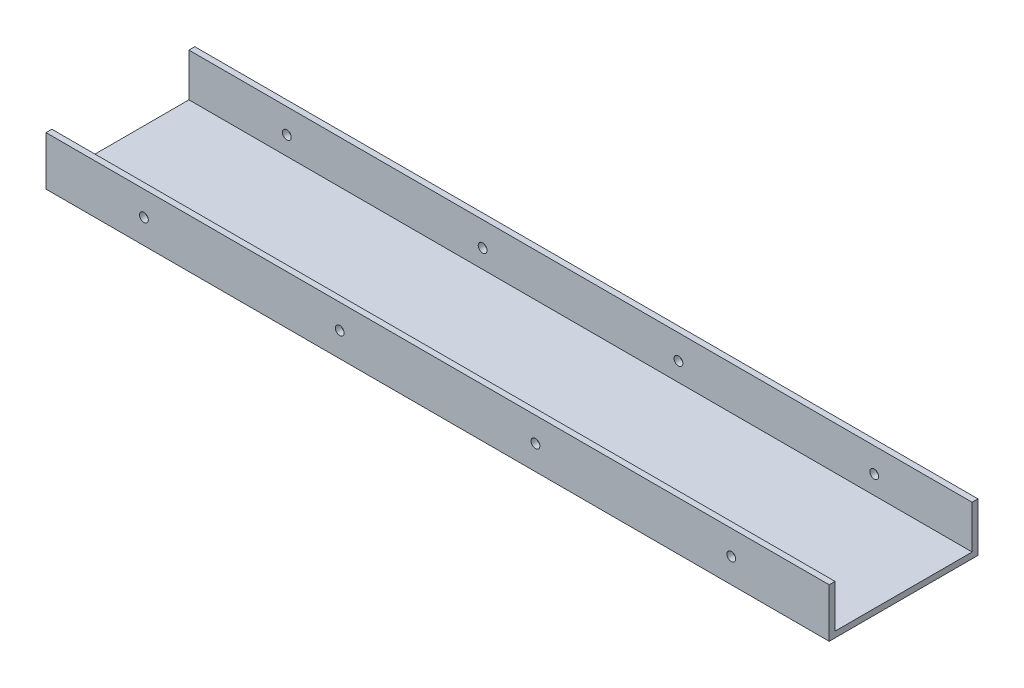
ISO-10303-21;
HEADER;
FILE_DESCRIPTION(('STEP AP214'),'2;1');
FILE_NAME('part.step','',(''),(''),'','','');
FILE_SCHEMA(('AUTOMOTIVE_DESIGN { 1 0 10303 214 1 1 1 1 }'));
ENDSEC;
DATA;
#1=APPLICATION_CONTEXT('core data for automotive mechanical design processes');
#2=APPLICATION_PROTOCOL_DEFINITION('international standard','automotive_design',2000,#1);
#3=PRODUCT_CONTEXT('',#1,'mechanical');
#4=PRODUCT('Part','Part','',(#3));
#5=PRODUCT_RELATED_PRODUCT_CATEGORY('part','',(#4));
#6=PRODUCT_DEFINITION_FORMATION('','',#4);
#7=PRODUCT_DEFINITION_CONTEXT('part definition',#1,'design');
#8=PRODUCT_DEFINITION('design','',#6,#7);
#9=PRODUCT_DEFINITION_SHAPE('','',#8);
#10=(LENGTH_UNIT() NAMED_UNIT(*) SI_UNIT(.MILLI.,.METRE.));
#11=(NAMED_UNIT(*) PLANE_ANGLE_UNIT() SI_UNIT($,.RADIAN.));
#12=(NAMED_UNIT(*) SI_UNIT($,.STERADIAN.) SOLID_ANGLE_UNIT());
#13=UNCERTAINTY_MEASURE_WITH_UNIT(LENGTH_MEASURE(1.E-05),#10,'distance_accuracy_value','');
#14=(GEOMETRIC_REPRESENTATION_CONTEXT(3) GLOBAL_UNCERTAINTY_ASSIGNED_CONTEXT((#13)) GLOBAL_UNIT_ASSIGNED_CONTEXT((#10,
#11,#12)) REPRESENTATION_CONTEXT('',''));
#15=CARTESIAN_POINT('',(0.,0.,0.));
#16=DIRECTION('',(0.,0.,1.));
#17=DIRECTION('',(1.,0.,0.));
#18=AXIS2_PLACEMENT_3D('',#15,#16,#17);
#19=CARTESIAN_POINT('',(0.,3.,0.));
#20=DIRECTION('',(0.,1.,0.));
#21=DIRECTION('',(0.,0.,1.));
#22=AXIS2_PLACEMENT_3D('',#19,#20,#21);
#23=PLANE('',#22);
#24=DIRECTION('',(0.,0.,-1.));
#25=VECTOR('',#24,1.);
#26=CARTESIAN_POINT('',(200.,3.,-38.));
#27=LINE('',#26,#25);
#28=CARTESIAN_POINT('',(200.,3.,35.));
#29=VERTEX_POINT('',#28);
#30=CARTESIAN_POINT('',(200.,3.,-35.));
#31=VERTEX_POINT('',#30);
#32=EDGE_CURVE('E63',#29,#31,#27,.T.);
#33=ORIENTED_EDGE('',*,*,#32,.T.);
#34=DIRECTION('',(1.,0.,0.));
#35=VECTOR('',#34,1.);
#36=CARTESIAN_POINT('',(-200.,3.,-35.));
#37=LINE('',#36,#35);
#38=CARTESIAN_POINT('',(-200.,3.,-35.));
#39=VERTEX_POINT('',#38);
#40=EDGE_CURVE('E58',#39,#31,#37,.T.);
#41=ORIENTED_EDGE('',*,*,#40,.F.);
#42=DIRECTION('',(0.,0.,1.));
#43=VECTOR('',#42,1.);
#44=CARTESIAN_POINT('',(-200.,3.,-38.));
#45=LINE('',#44,#43);
#46=CARTESIAN_POINT('',(-200.,3.,35.));
#47=VERTEX_POINT('',#46);
#48=EDGE_CURVE('E170',#39,#47,#45,.T.);
#49=ORIENTED_EDGE('',*,*,#48,.T.);
#50=DIRECTION('',(-1.,0.,0.));
#51=VECTOR('',#50,1.);
#52=CARTESIAN_POINT('',(-200.,3.,35.));
#53=LINE('',#52,#51);
#54=EDGE_CURVE('E139',#29,#47,#53,.T.);
#55=ORIENTED_EDGE('',*,*,#54,.F.);
#56=EDGE_LOOP('',(#33,#41,#49,#55));
#57=FACE_BOUND('',#56,.T.);
#58=ADVANCED_FACE('F40',(#57),#23,.T.);
#59=CARTESIAN_POINT('',(-200.,3.,-38.));
#60=DIRECTION('',(1.,0.,0.));
#61=DIRECTION('',(0.,0.,-1.));
#62=AXIS2_PLACEMENT_3D('',#59,#60,#61);
#63=PLANE('',#62);
#64=DIRECTION('',(0.,0.,1.));
#65=VECTOR('',#64,1.);
#66=CARTESIAN_POINT('',(-200.,0.,-38.));
#67=LINE('',#66,#65);
#68=CARTESIAN_POINT('',(-200.,0.,-38.));
#69=VERTEX_POINT('',#68);
#70=CARTESIAN_POINT('',(-200.,0.,38.));
#71=VERTEX_POINT('',#70);
#72=EDGE_CURVE('E169',#69,#71,#67,.T.);
#73=ORIENTED_EDGE('',*,*,#72,.T.);
#74=DIRECTION('',(0.,-1.,0.));
#75=VECTOR('',#74,1.);
#76=CARTESIAN_POINT('',(-200.,3.,38.));
#77=LINE('',#76,#75);
#78=CARTESIAN_POINT('',(-200.,25.,38.));
#79=VERTEX_POINT('',#78);
#80=EDGE_CURVE('E11',#79,#71,#77,.T.);
#81=ORIENTED_EDGE('',*,*,#80,.F.);
#82=DIRECTION('',(0.,0.,1.));
#83=VECTOR('',#82,1.);
#84=CARTESIAN_POINT('',(-200.,25.,38.));
#85=LINE('',#84,#83);
#86=CARTESIAN_POINT('',(-200.,25.,35.));
#87=VERTEX_POINT('',#86);
#88=EDGE_CURVE('E144',#87,#79,#85,.T.);
#89=ORIENTED_EDGE('',*,*,#88,.F.);
#90=DIRECTION('',(0.,-1.,0.));
#91=VECTOR('',#90,1.);
#92=CARTESIAN_POINT('',(-200.,25.,35.));
#93=LINE('',#92,#91);
#94=EDGE_CURVE('E158',#87,#47,#93,.T.);
#95=ORIENTED_EDGE('',*,*,#94,.T.);
#96=ORIENTED_EDGE('',*,*,#48,.F.);
#97=DIRECTION('',(0.,-1.,0.));
#98=VECTOR('',#97,1.);
#99=CARTESIAN_POINT('',(-200.,25.,-35.));
#100=LINE('',#99,#98);
#101=CARTESIAN_POINT('',(-200.,25.,-35.));
#102=VERTEX_POINT('',#101);
#103=EDGE_CURVE('E132',#102,#39,#100,.T.);
#104=ORIENTED_EDGE('',*,*,#103,.F.);
#105=DIRECTION('',(0.,0.,1.));
#106=VECTOR('',#105,1.);
#107=CARTESIAN_POINT('',(-200.,25.,-38.));
#108=LINE('',#107,#106);
#109=CARTESIAN_POINT('',(-200.,25.,-38.));
#110=VERTEX_POINT('',#109);
#111=EDGE_CURVE('E124',#110,#102,#108,.T.);
#112=ORIENTED_EDGE('',*,*,#111,.F.);
#113=DIRECTION('',(0.,-1.,0.));
#114=VECTOR('',#113,1.);
#115=CARTESIAN_POINT('',(-200.,3.,-38.));
#116=LINE('',#115,#114);
#117=EDGE_CURVE('E106',#110,#69,#116,.T.);
#118=ORIENTED_EDGE('',*,*,#117,.T.);
#119=EDGE_LOOP('',(#73,#81,#89,#95,#96,#104,#112,#118));
#120=FACE_BOUND('',#119,.T.);
#121=ADVANCED_FACE('F42',(#120),#63,.F.);
#122=CARTESIAN_POINT('',(-200.,3.,38.));
#123=DIRECTION('',(0.,0.,-1.));
#124=DIRECTION('',(-1.,0.,0.));
#125=AXIS2_PLACEMENT_3D('',#122,#123,#124);
#126=PLANE('',#125);
#127=CARTESIAN_POINT('',(-150.,12.5,38.));
#128=DIRECTION('',(0.,0.,1.));
#129=DIRECTION('',(1.,0.,0.));
#130=AXIS2_PLACEMENT_3D('',#127,#128,#129);
#131=CIRCLE('',#130,2.24999999999997);
#132=CARTESIAN_POINT('',(-147.75,12.5,38.));
#133=VERTEX_POINT('',#132);
#134=EDGE_CURVE('E309',#133,#133,#131,.T.);
#135=ORIENTED_EDGE('',*,*,#134,.F.);
#136=EDGE_LOOP('',(#135));
#137=FACE_BOUND('',#136,.T.);
#138=CARTESIAN_POINT('',(150.,12.5,38.));
#139=DIRECTION('',(0.,0.,1.));
#140=DIRECTION('',(1.,0.,0.));
#141=AXIS2_PLACEMENT_3D('',#138,#139,#140);
#142=CIRCLE('',#141,2.24999999999997);
#143=CARTESIAN_POINT('',(152.25,12.5,38.));
#144=VERTEX_POINT('',#143);
#145=EDGE_CURVE('E209',#144,#144,#142,.T.);
#146=ORIENTED_EDGE('',*,*,#145,.F.);
#147=EDGE_LOOP('',(#146));
#148=FACE_BOUND('',#147,.T.);
#149=CARTESIAN_POINT('',(-50.,12.5,38.));
#150=DIRECTION('',(0.,0.,1.));
#151=DIRECTION('',(1.,0.,0.));
#152=AXIS2_PLACEMENT_3D('',#149,#150,#151);
#153=CIRCLE('',#152,2.24999999999999);
#154=CARTESIAN_POINT('',(-47.75,12.5,38.));
#155=VERTEX_POINT('',#154);
#156=EDGE_CURVE('E206',#155,#155,#153,.T.);
#157=ORIENTED_EDGE('',*,*,#156,.F.);
#158=EDGE_LOOP('',(#157));
#159=FACE_BOUND('',#158,.T.);
#160=CARTESIAN_POINT('',(50.,12.5,38.));
#161=DIRECTION('',(0.,0.,1.));
#162=DIRECTION('',(1.,0.,0.));
#163=AXIS2_PLACEMENT_3D('',#160,#161,#162);
#164=CIRCLE('',#163,2.24999999999999);
#165=CARTESIAN_POINT('',(52.25,12.5,38.));
#166=VERTEX_POINT('',#165);
#167=EDGE_CURVE('E235',#166,#166,#164,.T.);
#168=ORIENTED_EDGE('',*,*,#167,.F.);
#169=EDGE_LOOP('',(#168));
#170=FACE_BOUND('',#169,.T.);
#171=DIRECTION('',(1.,0.,0.));
#172=VECTOR('',#171,1.);
#173=CARTESIAN_POINT('',(-200.,0.,38.));
#174=LINE('',#173,#172);
#175=CARTESIAN_POINT('',(200.,0.,38.));
#176=VERTEX_POINT('',#175);
#177=EDGE_CURVE('E177',#71,#176,#174,.T.);
#178=ORIENTED_EDGE('',*,*,#177,.T.);
#179=DIRECTION('',(0.,-1.,0.));
#180=VECTOR('',#179,1.);
#181=CARTESIAN_POINT('',(200.,3.,38.));
#182=LINE('',#181,#180);
#183=CARTESIAN_POINT('',(200.,25.,38.));
#184=VERTEX_POINT('',#183);
#185=EDGE_CURVE('E50',#184,#176,#182,.T.);
#186=ORIENTED_EDGE('',*,*,#185,.F.);
#187=DIRECTION('',(1.,0.,0.));
#188=VECTOR('',#187,1.);
#189=CARTESIAN_POINT('',(-200.,25.,38.));
#190=LINE('',#189,#188);
#191=EDGE_CURVE('E148',#79,#184,#190,.T.);
#192=ORIENTED_EDGE('',*,*,#191,.F.);
#193=ORIENTED_EDGE('',*,*,#80,.T.);
#194=EDGE_LOOP('',(#178,#186,#192,#193));
#195=FACE_BOUND('',#194,.T.);
#196=ADVANCED_FACE('F291',(#137,#148,#159,#170,#195),#126,.F.);
#197=CARTESIAN_POINT('',(200.,3.,-38.));
#198=DIRECTION('',(-1.,0.,0.));
#199=DIRECTION('',(0.,0.,1.));
#200=AXIS2_PLACEMENT_3D('',#197,#198,#199);
#201=PLANE('',#200);
#202=DIRECTION('',(0.,0.,-1.));
#203=VECTOR('',#202,1.);
#204=CARTESIAN_POINT('',(200.,0.,-38.));
#205=LINE('',#204,#203);
#206=CARTESIAN_POINT('',(200.,0.,-38.));
#207=VERTEX_POINT('',#206);
#208=EDGE_CURVE('E180',#176,#207,#205,.T.);
#209=ORIENTED_EDGE('',*,*,#208,.T.);
#210=DIRECTION('',(0.,-1.,0.));
#211=VECTOR('',#210,1.);
#212=CARTESIAN_POINT('',(200.,3.,-38.));
#213=LINE('',#212,#211);
#214=CARTESIAN_POINT('',(200.,25.,-38.));
#215=VERTEX_POINT('',#214);
#216=EDGE_CURVE('E118',#215,#207,#213,.T.);
#217=ORIENTED_EDGE('',*,*,#216,.F.);
#218=DIRECTION('',(0.,0.,-1.));
#219=VECTOR('',#218,1.);
#220=CARTESIAN_POINT('',(200.,25.,-38.));
#221=LINE('',#220,#219);
#222=CARTESIAN_POINT('',(200.,25.,-35.));
#223=VERTEX_POINT('',#222);
#224=EDGE_CURVE('E127',#223,#215,#221,.T.);
#225=ORIENTED_EDGE('',*,*,#224,.F.);
#226=DIRECTION('',(0.,-1.,0.));
#227=VECTOR('',#226,1.);
#228=CARTESIAN_POINT('',(200.,25.,-35.));
#229=LINE('',#228,#227);
#230=EDGE_CURVE('E129',#223,#31,#229,.T.);
#231=ORIENTED_EDGE('',*,*,#230,.T.);
#232=ORIENTED_EDGE('',*,*,#32,.F.);
#233=DIRECTION('',(0.,-1.,0.));
#234=VECTOR('',#233,1.);
#235=CARTESIAN_POINT('',(200.,25.,35.));
#236=LINE('',#235,#234);
#237=CARTESIAN_POINT('',(200.,25.,35.));
#238=VERTEX_POINT('',#237);
#239=EDGE_CURVE('E165',#238,#29,#236,.T.);
#240=ORIENTED_EDGE('',*,*,#239,.F.);
#241=DIRECTION('',(0.,0.,-1.));
#242=VECTOR('',#241,1.);
#243=CARTESIAN_POINT('',(200.,25.,38.));
#244=LINE('',#243,#242);
#245=EDGE_CURVE('E152',#184,#238,#244,.T.);
#246=ORIENTED_EDGE('',*,*,#245,.F.);
#247=ORIENTED_EDGE('',*,*,#185,.T.);
#248=EDGE_LOOP('',(#209,#217,#225,#231,#232,#240,#246,#247));
#249=FACE_BOUND('',#248,.T.);
#250=ADVANCED_FACE('F266',(#249),#201,.F.);
#251=CARTESIAN_POINT('',(-200.,3.,-38.));
#252=DIRECTION('',(0.,0.,1.));
#253=DIRECTION('',(1.,0.,0.));
#254=AXIS2_PLACEMENT_3D('',#251,#252,#253);
#255=PLANE('',#254);
#256=CARTESIAN_POINT('',(-150.,12.5,-38.));
#257=DIRECTION('',(0.,0.,1.));
#258=DIRECTION('',(1.,0.,0.));
#259=AXIS2_PLACEMENT_3D('',#256,#257,#258);
#260=CIRCLE('',#259,2.25);
#261=CARTESIAN_POINT('',(-147.75,12.5,-38.));
#262=VERTEX_POINT('',#261);
#263=EDGE_CURVE('E364',#262,#262,#260,.T.);
#264=ORIENTED_EDGE('',*,*,#263,.T.);
#265=EDGE_LOOP('',(#264));
#266=FACE_BOUND('',#265,.T.);
#267=CARTESIAN_POINT('',(150.,12.5,-38.));
#268=DIRECTION('',(0.,0.,1.));
#269=DIRECTION('',(1.,0.,0.));
#270=AXIS2_PLACEMENT_3D('',#267,#268,#269);
#271=CIRCLE('',#270,2.25);
#272=CARTESIAN_POINT('',(152.25,12.5,-38.));
#273=VERTEX_POINT('',#272);
#274=EDGE_CURVE('E199',#273,#273,#271,.T.);
#275=ORIENTED_EDGE('',*,*,#274,.T.);
#276=EDGE_LOOP('',(#275));
#277=FACE_BOUND('',#276,.T.);
#278=CARTESIAN_POINT('',(-50.,12.5,-38.));
#279=DIRECTION('',(0.,0.,1.));
#280=DIRECTION('',(1.,0.,0.));
#281=AXIS2_PLACEMENT_3D('',#278,#279,#280);
#282=CIRCLE('',#281,2.24999999999999);
#283=CARTESIAN_POINT('',(-47.75,12.5,-38.));
#284=VERTEX_POINT('',#283);
#285=EDGE_CURVE('E223',#284,#284,#282,.T.);
#286=ORIENTED_EDGE('',*,*,#285,.T.);
#287=EDGE_LOOP('',(#286));
#288=FACE_BOUND('',#287,.T.);
#289=CARTESIAN_POINT('',(50.,12.5,-38.));
#290=DIRECTION('',(0.,0.,1.));
#291=DIRECTION('',(1.,0.,0.));
#292=AXIS2_PLACEMENT_3D('',#289,#290,#291);
#293=CIRCLE('',#292,2.24999999999999);
#294=CARTESIAN_POINT('',(52.25,12.5,-38.));
#295=VERTEX_POINT('',#294);
#296=EDGE_CURVE('E194',#295,#295,#293,.T.);
#297=ORIENTED_EDGE('',*,*,#296,.T.);
#298=EDGE_LOOP('',(#297));
#299=FACE_BOUND('',#298,.T.);
#300=DIRECTION('',(-1.,0.,0.));
#301=VECTOR('',#300,1.);
#302=CARTESIAN_POINT('',(-200.,0.,-38.));
#303=LINE('',#302,#301);
#304=EDGE_CURVE('E112',#207,#69,#303,.T.);
#305=ORIENTED_EDGE('',*,*,#304,.T.);
#306=ORIENTED_EDGE('',*,*,#117,.F.);
#307=DIRECTION('',(-1.,0.,0.));
#308=VECTOR('',#307,1.);
#309=CARTESIAN_POINT('',(-200.,25.,-38.));
#310=LINE('',#309,#308);
#311=EDGE_CURVE('E110',#215,#110,#310,.T.);
#312=ORIENTED_EDGE('',*,*,#311,.F.);
#313=ORIENTED_EDGE('',*,*,#216,.T.);
#314=EDGE_LOOP('',(#305,#306,#312,#313));
#315=FACE_BOUND('',#314,.T.);
#316=ADVANCED_FACE('F108',(#266,#277,#288,#299,#315),#255,.F.);
#317=CARTESIAN_POINT('',(0.,0.,0.));
#318=DIRECTION('',(0.,1.,0.));
#319=DIRECTION('',(0.,0.,1.));
#320=AXIS2_PLACEMENT_3D('',#317,#318,#319);
#321=PLANE('',#320);
#322=ORIENTED_EDGE('',*,*,#72,.F.);
#323=ORIENTED_EDGE('',*,*,#304,.F.);
#324=ORIENTED_EDGE('',*,*,#208,.F.);
#325=ORIENTED_EDGE('',*,*,#177,.F.);
#326=EDGE_LOOP('',(#322,#323,#324,#325));
#327=FACE_BOUND('',#326,.T.);
#328=ADVANCED_FACE('F294',(#327),#321,.F.);
#329=CARTESIAN_POINT('',(-200.,25.,35.));
#330=DIRECTION('',(0.,0.,1.));
#331=DIRECTION('',(1.,0.,0.));
#332=AXIS2_PLACEMENT_3D('',#329,#330,#331);
#333=PLANE('',#332);
#334=CARTESIAN_POINT('',(-150.,12.5,35.));
#335=DIRECTION('',(0.,0.,1.));
#336=DIRECTION('',(1.,0.,0.));
#337=AXIS2_PLACEMENT_3D('',#334,#335,#336);
#338=CIRCLE('',#337,2.24999999999999);
#339=CARTESIAN_POINT('',(-147.75,12.5,35.));
#340=VERTEX_POINT('',#339);
#341=EDGE_CURVE('E216',#340,#340,#338,.T.);
#342=ORIENTED_EDGE('',*,*,#341,.T.);
#343=EDGE_LOOP('',(#342));
#344=FACE_BOUND('',#343,.T.);
#345=CARTESIAN_POINT('',(150.,12.5,35.));
#346=DIRECTION('',(0.,0.,1.));
#347=DIRECTION('',(1.,0.,0.));
#348=AXIS2_PLACEMENT_3D('',#345,#346,#347);
#349=CIRCLE('',#348,2.24999999999999);
#350=CARTESIAN_POINT('',(152.25,12.5,35.));
#351=VERTEX_POINT('',#350);
#352=EDGE_CURVE('E195',#351,#351,#349,.T.);
#353=ORIENTED_EDGE('',*,*,#352,.T.);
#354=EDGE_LOOP('',(#353));
#355=FACE_BOUND('',#354,.T.);
#356=CARTESIAN_POINT('',(-50.,12.5,35.));
#357=DIRECTION('',(0.,0.,1.));
#358=DIRECTION('',(1.,0.,0.));
#359=AXIS2_PLACEMENT_3D('',#356,#357,#358);
#360=CIRCLE('',#359,2.24999999999999);
#361=CARTESIAN_POINT('',(-47.75,12.5,35.));
#362=VERTEX_POINT('',#361);
#363=EDGE_CURVE('E227',#362,#362,#360,.T.);
#364=ORIENTED_EDGE('',*,*,#363,.T.);
#365=EDGE_LOOP('',(#364));
#366=FACE_BOUND('',#365,.T.);
#367=CARTESIAN_POINT('',(50.,12.5,35.));
#368=DIRECTION('',(0.,0.,1.));
#369=DIRECTION('',(1.,0.,0.));
#370=AXIS2_PLACEMENT_3D('',#367,#368,#369);
#371=CIRCLE('',#370,2.24999999999999);
#372=CARTESIAN_POINT('',(52.25,12.5,35.));
#373=VERTEX_POINT('',#372);
#374=EDGE_CURVE('E190',#373,#373,#371,.T.);
#375=ORIENTED_EDGE('',*,*,#374,.T.);
#376=EDGE_LOOP('',(#375));
#377=FACE_BOUND('',#376,.T.);
#378=ORIENTED_EDGE('',*,*,#54,.T.);
#379=ORIENTED_EDGE('',*,*,#94,.F.);
#380=DIRECTION('',(-1.,0.,0.));
#381=VECTOR('',#380,1.);
#382=CARTESIAN_POINT('',(-200.,25.,35.));
#383=LINE('',#382,#381);
#384=EDGE_CURVE('E155',#238,#87,#383,.T.);
#385=ORIENTED_EDGE('',*,*,#384,.F.);
#386=ORIENTED_EDGE('',*,*,#239,.T.);
#387=EDGE_LOOP('',(#378,#379,#385,#386));
#388=FACE_BOUND('',#387,.T.);
#389=ADVANCED_FACE('F280',(#344,#355,#366,#377,#388),#333,.F.);
#390=CARTESIAN_POINT('',(0.,25.,0.));
#391=DIRECTION('',(0.,-1.,0.));
#392=DIRECTION('',(0.,0.,-1.));
#393=AXIS2_PLACEMENT_3D('',#390,#391,#392);
#394=PLANE('',#393);
#395=ORIENTED_EDGE('',*,*,#88,.T.);
#396=ORIENTED_EDGE('',*,*,#191,.T.);
#397=ORIENTED_EDGE('',*,*,#245,.T.);
#398=ORIENTED_EDGE('',*,*,#384,.T.);
#399=EDGE_LOOP('',(#395,#396,#397,#398));
#400=FACE_BOUND('',#399,.T.);
#401=ADVANCED_FACE('F271',(#400),#394,.F.);
#402=CARTESIAN_POINT('',(-200.,25.,-35.));
#403=DIRECTION('',(0.,0.,-1.));
#404=DIRECTION('',(-1.,0.,0.));
#405=AXIS2_PLACEMENT_3D('',#402,#403,#404);
#406=PLANE('',#405);
#407=CARTESIAN_POINT('',(-150.,12.5,-35.));
#408=DIRECTION('',(0.,0.,-1.));
#409=DIRECTION('',(-1.,0.,0.));
#410=AXIS2_PLACEMENT_3D('',#407,#408,#409);
#411=CIRCLE('',#410,2.24999999999999);
#412=CARTESIAN_POINT('',(-152.25,12.5,-35.));
#413=VERTEX_POINT('',#412);
#414=EDGE_CURVE('E44',#413,#413,#411,.T.);
#415=ORIENTED_EDGE('',*,*,#414,.T.);
#416=EDGE_LOOP('',(#415));
#417=FACE_BOUND('',#416,.T.);
#418=CARTESIAN_POINT('',(150.,12.5,-35.));
#419=DIRECTION('',(0.,0.,-1.));
#420=DIRECTION('',(-1.,0.,0.));
#421=AXIS2_PLACEMENT_3D('',#418,#419,#420);
#422=CIRCLE('',#421,2.24999999999999);
#423=CARTESIAN_POINT('',(147.75,12.5,-35.));
#424=VERTEX_POINT('',#423);
#425=EDGE_CURVE('E198',#424,#424,#422,.T.);
#426=ORIENTED_EDGE('',*,*,#425,.T.);
#427=EDGE_LOOP('',(#426));
#428=FACE_BOUND('',#427,.T.);
#429=CARTESIAN_POINT('',(-50.,12.5,-35.));
#430=DIRECTION('',(0.,0.,-1.));
#431=DIRECTION('',(-1.,0.,0.));
#432=AXIS2_PLACEMENT_3D('',#429,#430,#431);
#433=CIRCLE('',#432,2.24999999999999);
#434=CARTESIAN_POINT('',(-52.25,12.5,-35.));
#435=VERTEX_POINT('',#434);
#436=EDGE_CURVE('E231',#435,#435,#433,.T.);
#437=ORIENTED_EDGE('',*,*,#436,.T.);
#438=EDGE_LOOP('',(#437));
#439=FACE_BOUND('',#438,.T.);
#440=CARTESIAN_POINT('',(50.,12.5,-35.));
#441=DIRECTION('',(0.,0.,-1.));
#442=DIRECTION('',(-1.,0.,0.));
#443=AXIS2_PLACEMENT_3D('',#440,#441,#442);
#444=CIRCLE('',#443,2.24999999999999);
#445=CARTESIAN_POINT('',(47.75,12.5,-35.));
#446=VERTEX_POINT('',#445);
#447=EDGE_CURVE('E193',#446,#446,#444,.T.);
#448=ORIENTED_EDGE('',*,*,#447,.T.);
#449=EDGE_LOOP('',(#448));
#450=FACE_BOUND('',#449,.T.);
#451=ORIENTED_EDGE('',*,*,#40,.T.);
#452=ORIENTED_EDGE('',*,*,#230,.F.);
#453=DIRECTION('',(1.,0.,0.));
#454=VECTOR('',#453,1.);
#455=CARTESIAN_POINT('',(-200.,25.,-35.));
#456=LINE('',#455,#454);
#457=EDGE_CURVE('E134',#102,#223,#456,.T.);
#458=ORIENTED_EDGE('',*,*,#457,.F.);
#459=ORIENTED_EDGE('',*,*,#103,.T.);
#460=EDGE_LOOP('',(#451,#452,#458,#459));
#461=FACE_BOUND('',#460,.T.);
#462=ADVANCED_FACE('F269',(#417,#428,#439,#450,#461),#406,.F.);
#463=CARTESIAN_POINT('',(0.,25.,0.));
#464=DIRECTION('',(0.,1.,0.));
#465=DIRECTION('',(0.,0.,1.));
#466=AXIS2_PLACEMENT_3D('',#463,#464,#465);
#467=PLANE('',#466);
#468=ORIENTED_EDGE('',*,*,#111,.T.);
#469=ORIENTED_EDGE('',*,*,#457,.T.);
#470=ORIENTED_EDGE('',*,*,#224,.T.);
#471=ORIENTED_EDGE('',*,*,#311,.T.);
#472=EDGE_LOOP('',(#468,#469,#470,#471));
#473=FACE_BOUND('',#472,.T.);
#474=ADVANCED_FACE('F123',(#473),#467,.T.);
#475=CARTESIAN_POINT('',(50.,12.5,38.));
#476=DIRECTION('',(0.,0.,1.));
#477=DIRECTION('',(1.,0.,0.));
#478=AXIS2_PLACEMENT_3D('',#475,#476,#477);
#479=CYLINDRICAL_SURFACE('',#478,2.24999999999999);
#480=ORIENTED_EDGE('',*,*,#167,.T.);
#481=EDGE_LOOP('',(#480));
#482=FACE_BOUND('',#481,.T.);
#483=ORIENTED_EDGE('',*,*,#374,.F.);
#484=EDGE_LOOP('',(#483));
#485=FACE_BOUND('',#484,.T.);
#486=ADVANCED_FACE('F278',(#482,#485),#479,.F.);
#487=ORIENTED_EDGE('',*,*,#296,.F.);
#488=EDGE_LOOP('',(#487));
#489=FACE_BOUND('',#488,.T.);
#490=ORIENTED_EDGE('',*,*,#447,.F.);
#491=EDGE_LOOP('',(#490));
#492=FACE_BOUND('',#491,.T.);
#493=ADVANCED_FACE('F335',(#489,#492),#479,.F.);
#494=CARTESIAN_POINT('',(-50.,12.5,38.));
#495=DIRECTION('',(0.,0.,1.));
#496=DIRECTION('',(1.,0.,0.));
#497=AXIS2_PLACEMENT_3D('',#494,#495,#496);
#498=CYLINDRICAL_SURFACE('',#497,2.24999999999999);
#499=ORIENTED_EDGE('',*,*,#285,.F.);
#500=EDGE_LOOP('',(#499));
#501=FACE_BOUND('',#500,.T.);
#502=ORIENTED_EDGE('',*,*,#436,.F.);
#503=EDGE_LOOP('',(#502));
#504=FACE_BOUND('',#503,.T.);
#505=ADVANCED_FACE('F340',(#501,#504),#498,.F.);
#506=ORIENTED_EDGE('',*,*,#156,.T.);
#507=EDGE_LOOP('',(#506));
#508=FACE_BOUND('',#507,.T.);
#509=ORIENTED_EDGE('',*,*,#363,.F.);
#510=EDGE_LOOP('',(#509));
#511=FACE_BOUND('',#510,.T.);
#512=ADVANCED_FACE('F345',(#508,#511),#498,.F.);
#513=CARTESIAN_POINT('',(150.,12.5,38.));
#514=DIRECTION('',(0.,0.,1.));
#515=DIRECTION('',(1.,0.,0.));
#516=AXIS2_PLACEMENT_3D('',#513,#514,#515);
#517=CYLINDRICAL_SURFACE('',#516,2.24999999999999);
#518=ORIENTED_EDGE('',*,*,#145,.T.);
#519=EDGE_LOOP('',(#518));
#520=FACE_BOUND('',#519,.T.);
#521=ORIENTED_EDGE('',*,*,#352,.F.);
#522=EDGE_LOOP('',(#521));
#523=FACE_BOUND('',#522,.T.);
#524=ADVANCED_FACE('F351',(#520,#523),#517,.F.);
#525=ORIENTED_EDGE('',*,*,#274,.F.);
#526=EDGE_LOOP('',(#525));
#527=FACE_BOUND('',#526,.T.);
#528=ORIENTED_EDGE('',*,*,#425,.F.);
#529=EDGE_LOOP('',(#528));
#530=FACE_BOUND('',#529,.T.);
#531=ADVANCED_FACE('F347',(#527,#530),#517,.F.);
#532=CARTESIAN_POINT('',(-150.,12.5,38.));
#533=DIRECTION('',(0.,0.,1.));
#534=DIRECTION('',(1.,0.,0.));
#535=AXIS2_PLACEMENT_3D('',#532,#533,#534);
#536=CYLINDRICAL_SURFACE('',#535,2.24999999999999);
#537=ORIENTED_EDGE('',*,*,#263,.F.);
#538=EDGE_LOOP('',(#537));
#539=FACE_BOUND('',#538,.T.);
#540=ORIENTED_EDGE('',*,*,#414,.F.);
#541=EDGE_LOOP('',(#540));
#542=FACE_BOUND('',#541,.T.);
#543=ADVANCED_FACE('F350',(#539,#542),#536,.F.);
#544=ORIENTED_EDGE('',*,*,#134,.T.);
#545=EDGE_LOOP('',(#544));
#546=FACE_BOUND('',#545,.T.);
#547=ORIENTED_EDGE('',*,*,#341,.F.);
#548=EDGE_LOOP('',(#547));
#549=FACE_BOUND('',#548,.T.);
#550=ADVANCED_FACE('F353',(#546,#549),#536,.F.);
#551=CLOSED_SHELL('',(#58,#121,#196,#250,#316,#328,#389,#401,#462,#474,#486,#493,#505,#512,#524,
#531,#543,#550));
#552=MANIFOLD_SOLID_BREP('B2',#551);
#553=ADVANCED_BREP_SHAPE_REPRESENTATION('',(#18,#552),#14);
#554=SHAPE_DEFINITION_REPRESENTATION(#9,#553);
ENDSEC;
END-ISO-10303-21;
